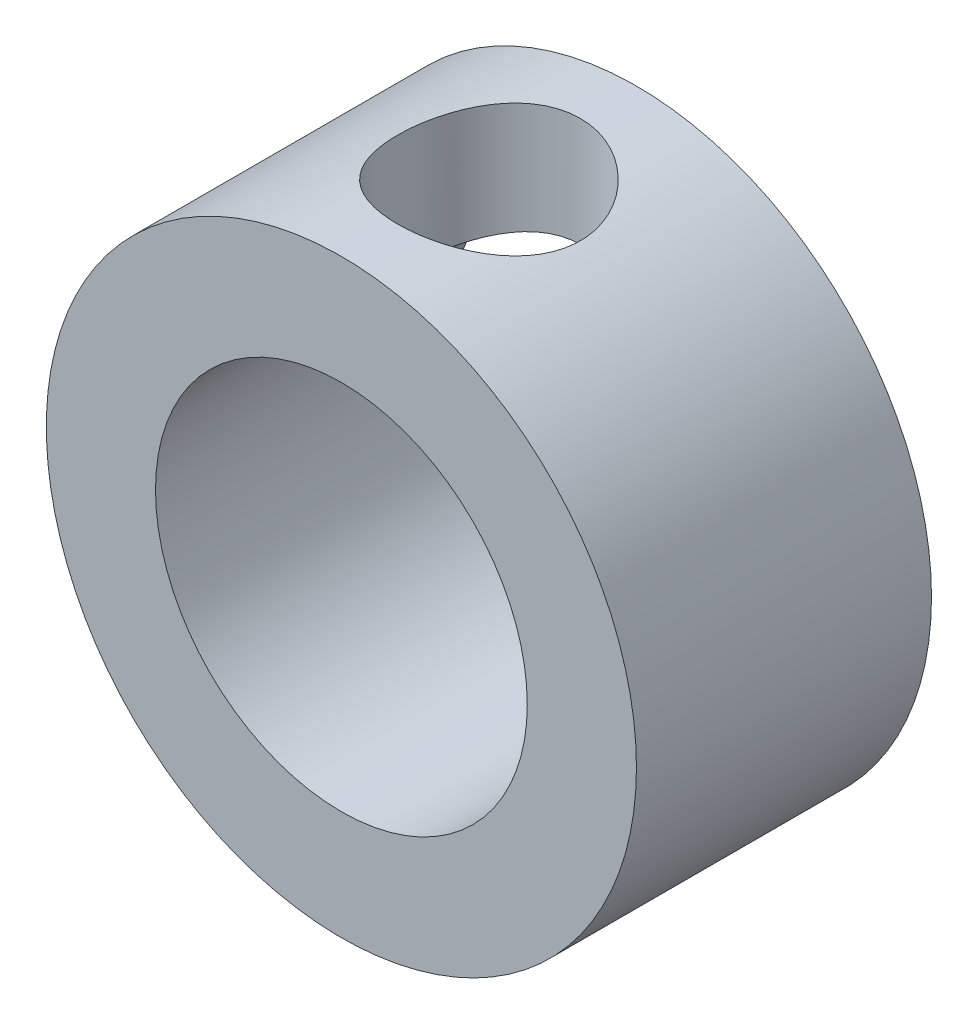
ISO-10303-21;
HEADER;
FILE_DESCRIPTION(('STEP AP214'),'2;1');
FILE_NAME('part.step','',(''),(''),'','','');
FILE_SCHEMA(('AUTOMOTIVE_DESIGN { 1 0 10303 214 1 1 1 1 }'));
ENDSEC;
DATA;
#1=APPLICATION_CONTEXT('core data for automotive mechanical design processes');
#2=APPLICATION_PROTOCOL_DEFINITION('international standard','automotive_design',2000,#1);
#3=PRODUCT_CONTEXT('',#1,'mechanical');
#4=PRODUCT('Part','Part','',(#3));
#5=PRODUCT_RELATED_PRODUCT_CATEGORY('part','',(#4));
#6=PRODUCT_DEFINITION_FORMATION('','',#4);
#7=PRODUCT_DEFINITION_CONTEXT('part definition',#1,'design');
#8=PRODUCT_DEFINITION('design','',#6,#7);
#9=PRODUCT_DEFINITION_SHAPE('','',#8);
#10=(LENGTH_UNIT() NAMED_UNIT(*) SI_UNIT(.MILLI.,.METRE.));
#11=(NAMED_UNIT(*) PLANE_ANGLE_UNIT() SI_UNIT($,.RADIAN.));
#12=(NAMED_UNIT(*) SI_UNIT($,.STERADIAN.) SOLID_ANGLE_UNIT());
#13=UNCERTAINTY_MEASURE_WITH_UNIT(LENGTH_MEASURE(1.E-05),#10,'distance_accuracy_value','');
#14=(GEOMETRIC_REPRESENTATION_CONTEXT(3) GLOBAL_UNCERTAINTY_ASSIGNED_CONTEXT((#13)) GLOBAL_UNIT_ASSIGNED_CONTEXT((#10,
#11,#12)) REPRESENTATION_CONTEXT('',''));
#15=CARTESIAN_POINT('',(0.,0.,0.));
#16=DIRECTION('',(0.,0.,1.));
#17=DIRECTION('',(1.,0.,0.));
#18=AXIS2_PLACEMENT_3D('',#15,#16,#17);
#19=CARTESIAN_POINT('',(0.,0.,12.7));
#20=DIRECTION('',(0.,0.,1.));
#21=DIRECTION('',(1.,0.,0.));
#22=AXIS2_PLACEMENT_3D('',#19,#20,#21);
#23=PLANE('',#22);
#24=CARTESIAN_POINT('',(0.,0.,12.7));
#25=DIRECTION('',(0.,0.,1.));
#26=DIRECTION('',(1.,0.,0.));
#27=AXIS2_PLACEMENT_3D('',#24,#25,#26);
#28=CIRCLE('',#27,12.7);
#29=CARTESIAN_POINT('',(12.7,0.,12.7));
#30=VERTEX_POINT('',#29);
#31=EDGE_CURVE('E10',#30,#30,#28,.T.);
#32=ORIENTED_EDGE('',*,*,#31,.T.);
#33=EDGE_LOOP('',(#32));
#34=FACE_BOUND('',#33,.T.);
#35=CARTESIAN_POINT('',(0.,0.,12.7));
#36=DIRECTION('',(0.,0.,1.));
#37=DIRECTION('',(1.,0.,0.));
#38=AXIS2_PLACEMENT_3D('',#35,#36,#37);
#39=CIRCLE('',#38,8.001);
#40=CARTESIAN_POINT('',(8.001,0.,12.7));
#41=VERTEX_POINT('',#40);
#42=EDGE_CURVE('E42',#41,#41,#39,.T.);
#43=ORIENTED_EDGE('',*,*,#42,.F.);
#44=EDGE_LOOP('',(#43));
#45=FACE_BOUND('',#44,.T.);
#46=ADVANCED_FACE('F31',(#34,#45),#23,.T.);
#47=CARTESIAN_POINT('',(0.,0.,0.));
#48=DIRECTION('',(0.,0.,1.));
#49=DIRECTION('',(1.,0.,0.));
#50=AXIS2_PLACEMENT_3D('',#47,#48,#49);
#51=PLANE('',#50);
#52=CARTESIAN_POINT('',(0.,0.,0.));
#53=DIRECTION('',(0.,0.,1.));
#54=DIRECTION('',(1.,0.,0.));
#55=AXIS2_PLACEMENT_3D('',#52,#53,#54);
#56=CIRCLE('',#55,12.7);
#57=CARTESIAN_POINT('',(12.7,0.,0.));
#58=VERTEX_POINT('',#57);
#59=EDGE_CURVE('E35',#58,#58,#56,.T.);
#60=ORIENTED_EDGE('',*,*,#59,.F.);
#61=EDGE_LOOP('',(#60));
#62=FACE_BOUND('',#61,.T.);
#63=CARTESIAN_POINT('',(0.,0.,0.));
#64=DIRECTION('',(0.,0.,1.));
#65=DIRECTION('',(1.,0.,0.));
#66=AXIS2_PLACEMENT_3D('',#63,#64,#65);
#67=CIRCLE('',#66,8.001);
#68=CARTESIAN_POINT('',(8.001,0.,0.));
#69=VERTEX_POINT('',#68);
#70=EDGE_CURVE('E44',#69,#69,#67,.T.);
#71=ORIENTED_EDGE('',*,*,#70,.T.);
#72=EDGE_LOOP('',(#71));
#73=FACE_BOUND('',#72,.T.);
#74=ADVANCED_FACE('F73',(#62,#73),#51,.F.);
#75=CARTESIAN_POINT('',(0.,0.,12.7));
#76=DIRECTION('',(0.,0.,-1.));
#77=DIRECTION('',(-1.,0.,0.));
#78=AXIS2_PLACEMENT_3D('',#75,#76,#77);
#79=CYLINDRICAL_SURFACE('',#78,12.7);
#80=CARTESIAN_POINT('',(0.,12.7,10.287));
#81=CARTESIAN_POINT('',(0.215642089486983,12.6999987563342,10.2869983381677));
#82=CARTESIAN_POINT('',(0.431301317589646,12.6944557181627,10.2692244339549));
#83=CARTESIAN_POINT('',(0.856318380775849,12.6728861910642,10.198781199652));
#84=CARTESIAN_POINT('',(1.06567468547736,12.6568571772227,10.1461034650415));
#85=CARTESIAN_POINT('',(1.47189536618363,12.6160678259516,10.0077958035015));
#86=CARTESIAN_POINT('',(1.6687783589184,12.5913208806436,9.92221640042583));
#87=CARTESIAN_POINT('',(2.04539992702669,12.535654259212,9.72074807214478));
#88=CARTESIAN_POINT('',(2.22513587873847,12.5047336406885,9.60485451870215));
#89=CARTESIAN_POINT('',(2.56783415502708,12.4389521785514,9.34233271423796));
#90=CARTESIAN_POINT('',(2.73020107321679,12.4040065133576,9.19494854382388));
#91=CARTESIAN_POINT('',(3.02835442268771,12.3346078095994,8.87523903250918));
#92=CARTESIAN_POINT('',(3.16413600443,12.3001548619741,8.70290915111373));
#93=CARTESIAN_POINT('',(3.40847342926337,12.2347349225514,8.33306923185896));
#94=CARTESIAN_POINT('',(3.51628893124856,12.2038727666813,8.13504978218122));
#95=CARTESIAN_POINT('',(3.69684203312242,12.1504028689669,7.72257871212896));
#96=CARTESIAN_POINT('',(3.76958870623598,12.1277929924098,7.50813135874186));
#97=CARTESIAN_POINT('',(3.87576689166818,12.0942741927572,7.07560404333032));
#98=CARTESIAN_POINT('',(3.91030151888804,12.0830378066601,6.85782095565567));
#99=CARTESIAN_POINT('',(3.94252125216785,12.0725655704575,6.41928435562595));
#100=CARTESIAN_POINT('',(3.94021597619219,12.0733265881334,6.19853163360437));
#101=CARTESIAN_POINT('',(3.89968486889254,12.0864738855603,5.76941548492105));
#102=CARTESIAN_POINT('',(3.86285717967211,12.0984076506619,5.56090380903797));
#103=CARTESIAN_POINT('',(3.75659192607623,12.1318213065387,5.1531779329988));
#104=CARTESIAN_POINT('',(3.68715094635025,12.1533021971016,4.95396470900402));
#105=CARTESIAN_POINT('',(3.51663434847949,12.203739449427,4.56714194130884));
#106=CARTESIAN_POINT('',(3.41511679174336,12.2327991885827,4.37974126722153));
#107=CARTESIAN_POINT('',(3.18363572068765,12.2950720045889,4.02417431880269));
#108=CARTESIAN_POINT('',(3.05366491635364,12.3282861449031,3.85601299063211));
#109=CARTESIAN_POINT('',(2.76208914863372,12.3969447621297,3.53578868453762));
#110=CARTESIAN_POINT('',(2.59932873251423,12.4324225295463,3.38478301518827));
#111=CARTESIAN_POINT('',(2.25035315821874,12.5002986527697,3.1119548140765));
#112=CARTESIAN_POINT('',(2.06413631873757,12.5326967875427,2.9901343760659));
#113=CARTESIAN_POINT('',(1.67151986106116,12.591094214646,2.77843348953781));
#114=CARTESIAN_POINT('',(1.4649782151005,12.617043244784,2.68880164279578));
#115=CARTESIAN_POINT('',(1.03875800163217,12.6592560297351,2.54586641692718));
#116=CARTESIAN_POINT('',(0.819083378279634,12.6755226764853,2.49255218975551));
#117=CARTESIAN_POINT('',(0.381810448669293,12.6960741446153,2.42555838495621));
#118=CARTESIAN_POINT('',(0.164451494201548,12.7007915511028,2.41044714389471));
#119=CARTESIAN_POINT('',(-0.269717798170264,12.6989903182584,2.4162565318587));
#120=CARTESIAN_POINT('',(-0.486528210331215,12.6924732913479,2.43717199015388));
#121=CARTESIAN_POINT('',(-0.907947885226378,12.6692194956137,2.513290005732));
#122=CARTESIAN_POINT('',(-1.11272576272166,12.6527358837941,2.56764378928676));
#123=CARTESIAN_POINT('',(-1.51020076987316,12.6114731166706,2.70806281613964));
#124=CARTESIAN_POINT('',(-1.70289641145608,12.5866929419182,2.79413195662494));
#125=CARTESIAN_POINT('',(-2.07590862109453,12.5306447805498,2.9978629413193));
#126=CARTESIAN_POINT('',(-2.25581416564056,12.4992346426345,3.11623715258801));
#127=CARTESIAN_POINT('',(-2.59368931433654,12.4335212424987,3.38036119909146));
#128=CARTESIAN_POINT('',(-2.75165303985925,12.3992172088904,3.52611834621928));
#129=CARTESIAN_POINT('',(-3.04754548779429,12.3299019174205,3.84760329987095));
#130=CARTESIAN_POINT('',(-3.18445414061207,12.294915159498,4.02427736904234));
#131=CARTESIAN_POINT('',(-3.42676814889427,12.2295978804089,4.39885276631564));
#132=CARTESIAN_POINT('',(-3.53217407716747,12.1992672745851,4.59675370836395));
#133=CARTESIAN_POINT('',(-3.70782043558742,12.1470359182359,5.00770814027043));
#134=CARTESIAN_POINT('',(-3.77820318738893,12.1251011354377,5.22069621954313));
#135=CARTESIAN_POINT('',(-3.88186191379076,12.0923182688246,5.65631758311547));
#136=CARTESIAN_POINT('',(-3.91515171874048,12.0814660529278,5.87894724030239));
#137=CARTESIAN_POINT('',(-3.94269697541239,12.0725028904522,6.31688210039164));
#138=CARTESIAN_POINT('',(-3.93862366220354,12.0738464055454,6.53207233464024));
#139=CARTESIAN_POINT('',(-3.89558356334961,12.0878008302732,6.95854334156855));
#140=CARTESIAN_POINT('',(-3.85661835720876,12.1004112298726,7.16982429077391));
#141=CARTESIAN_POINT('',(-3.74601134558578,12.1351003944793,7.57954296032231));
#142=CARTESIAN_POINT('',(-3.67484051149708,12.1570424257581,7.77812027073965));
#143=CARTESIAN_POINT('',(-3.50221244498937,12.2078895642286,8.16067377466573));
#144=CARTESIAN_POINT('',(-3.40074912314418,12.2367960712003,8.3446470230296));
#145=CARTESIAN_POINT('',(-3.16583681693642,12.299706675948,8.70045253083303));
#146=CARTESIAN_POINT('',(-3.031304814092,12.3338644175725,8.87154252800162));
#147=CARTESIAN_POINT('',(-2.73598855917659,12.4027143096462,9.18925994506663));
#148=CARTESIAN_POINT('',(-2.57519732918472,12.4374065999169,9.33588084174014));
#149=CARTESIAN_POINT('',(-2.2257449055815,12.5047461104516,9.60518291683529));
#150=CARTESIAN_POINT('',(-2.03635744604298,12.5372925872449,9.7269496322864));
#151=CARTESIAN_POINT('',(-1.63879142431975,12.5954207736272,9.93675317700581));
#152=CARTESIAN_POINT('',(-1.43062058099889,12.6210053269557,10.0248037843074));
#153=CARTESIAN_POINT('',(-1.02056324107983,12.6604515654367,10.1579747881106));
#154=CARTESIAN_POINT('',(-0.81976978605113,12.6751547281573,10.2062215570526));
#155=CARTESIAN_POINT('',(-0.412655394574239,12.6949286021706,10.2707318426619));
#156=CARTESIAN_POINT('',(-0.206335542898133,12.7000011899925,10.287001590112));
#157=CARTESIAN_POINT('',(0.,12.7,10.287));
#158=B_SPLINE_CURVE_WITH_KNOTS('',3,(#80,#81,#82,#83,#84,#85,#86,#87,#88,#89,#90,#91,#92,#93,
#94,#95,#96,#97,#98,#99,#100,#101,#102,#103,#104,#105,#106,#107,#108,#109,#110,#111,#112,#113,
#114,#115,#116,#117,#118,#119,#120,#121,#122,#123,#124,#125,#126,#127,#128,#129,#130,#131,#132,
#133,#134,#135,#136,#137,#138,#139,#140,#141,#142,#143,#144,#145,#146,#147,#148,#149,#150,#151,
#152,#153,#154,#155,#156,#157),.UNSPECIFIED.,.T.,.F.,(4,2,2,2,2,2,2,2,2,2,2,2,2,2,2,2,2,2,2,2,2,
2,2,2,2,2,2,2,2,2,2,2,2,2,2,2,2,2,4),(0.,0.646167948690249,1.29249154523124,1.93782658508891,
2.58326020955959,3.24639981304979,3.9096602700524,4.58901006762707,5.26818400514975,
5.92719377915793,6.58603150523925,7.21928891462372,7.8526126552007,8.49507333584608,
9.13769881456589,9.80908495704148,10.4805192504219,11.1570330250362,11.8333446367931,
12.4839082677489,13.1343785343706,13.7689825533425,14.403664578557,15.0536649384308,
15.7038391111452,16.3793387552344,17.0548261160791,17.7275456528965,18.4000142777847,
19.0425556535301,19.6850679438511,20.3184735488257,20.952006567458,21.6099821106715,
22.2681327844909,22.9473097519694,23.6262088779247,24.2446104225972,24.8628914586119),.UNSPECIFIED.);
#159=CARTESIAN_POINT('',(0.,12.7,10.287));
#160=VERTEX_POINT('',#159);
#161=EDGE_CURVE('E56',#160,#160,#158,.T.);
#162=ORIENTED_EDGE('',*,*,#161,.F.);
#163=EDGE_LOOP('',(#162));
#164=FACE_BOUND('',#163,.T.);
#165=ORIENTED_EDGE('',*,*,#31,.F.);
#166=EDGE_LOOP('',(#165));
#167=FACE_BOUND('',#166,.T.);
#168=ORIENTED_EDGE('',*,*,#59,.T.);
#169=EDGE_LOOP('',(#168));
#170=FACE_BOUND('',#169,.T.);
#171=ADVANCED_FACE('F33',(#164,#167,#170),#79,.T.);
#172=CARTESIAN_POINT('',(0.,0.,12.7));
#173=DIRECTION('',(0.,0.,-1.));
#174=DIRECTION('',(-1.,0.,0.));
#175=AXIS2_PLACEMENT_3D('',#172,#173,#174);
#176=CYLINDRICAL_SURFACE('',#175,8.001);
#177=CARTESIAN_POINT('',(0.,8.001,10.287));
#178=CARTESIAN_POINT('',(0.103731120040512,8.00099954830052,10.2869994807094));
#179=CARTESIAN_POINT('',(0.207472620866932,7.99897775985116,10.2828953118971));
#180=CARTESIAN_POINT('',(0.414192612313325,7.99094207562877,10.2665255803535));
#181=CARTESIAN_POINT('',(0.517170733633973,7.98492636082867,10.2542562988292));
#182=CARTESIAN_POINT('',(0.721708476706744,7.96904437787293,10.2216715759826));
#183=CARTESIAN_POINT('',(0.82326574050843,7.95917235075002,10.2013440999802));
#184=CARTESIAN_POINT('',(1.02409143363157,7.93583552887101,10.1528800597004));
#185=CARTESIAN_POINT('',(1.12335890919748,7.92236926536674,10.1247403028246));
#186=CARTESIAN_POINT('',(1.41586848701982,7.87718115569392,10.0292853471816));
#187=CARTESIAN_POINT('',(1.60484022218182,7.84058564914923,9.95076836464114));
#188=CARTESIAN_POINT('',(1.96655821159815,7.75778340676551,9.76670904580813));
#189=CARTESIAN_POINT('',(2.13930608053195,7.71157762886277,9.66116940284858));
#190=CARTESIAN_POINT('',(2.47530469331689,7.61061116771707,9.41890744840402));
#191=CARTESIAN_POINT('',(2.6373897616399,7.55550617218046,9.28071023355222));
#192=CARTESIAN_POINT('',(2.93713118735264,7.44411783251729,8.98027819701658));
#193=CARTESIAN_POINT('',(3.07476955751481,7.38783365454013,8.81802583591714));
#194=CARTESIAN_POINT('',(3.33205601945553,7.27561388999582,8.45938557910019));
#195=CARTESIAN_POINT('',(3.44960017708995,7.22001660372431,8.26135519681307));
#196=CARTESIAN_POINT('',(3.5992535240305,7.14594146537472,7.94958822473537));
#197=CARTESIAN_POINT('',(3.64470512444351,7.12279690556088,7.84317346392566));
#198=CARTESIAN_POINT('',(3.72625869504943,7.0804737169204,7.6260806595587));
#199=CARTESIAN_POINT('',(3.76236612370792,7.06129277404383,7.51540514855728));
#200=CARTESIAN_POINT('',(3.82293824347086,7.02867407138054,7.2971950186589));
#201=CARTESIAN_POINT('',(3.84796029647058,7.01496605736498,7.1898551926775));
#202=CARTESIAN_POINT('',(3.88895725579223,6.99232171706232,6.97301281147338));
#203=CARTESIAN_POINT('',(3.90493689049011,6.98338289705336,6.86351141761706));
#204=CARTESIAN_POINT('',(3.92761752942318,6.97065219167898,6.64331400515601));
#205=CARTESIAN_POINT('',(3.93432371759878,6.96685743076145,6.53261868887356));
#206=CARTESIAN_POINT('',(3.93836624505567,6.96457310453725,6.31100844001372));
#207=CARTESIAN_POINT('',(3.93570342915494,6.96608306089578,6.20009352813898));
#208=CARTESIAN_POINT('',(3.92189766636588,6.97386351911471,5.991827720554));
#209=CARTESIAN_POINT('',(3.91176752044538,6.97956525760828,5.89438693406567));
#210=CARTESIAN_POINT('',(3.88434096537129,6.99486483722935,5.70081965249849));
#211=CARTESIAN_POINT('',(3.86704229495444,7.00446390772487,5.60469358203063));
#212=CARTESIAN_POINT('',(3.80466105766818,7.03866961831927,5.3192897579736));
#213=CARTESIAN_POINT('',(3.74908319312322,7.06869095432302,5.13283955903089));
#214=CARTESIAN_POINT('',(3.61053079089778,7.14046405452993,4.76787795323816));
#215=CARTESIAN_POINT('',(3.52694750873285,7.18247307875893,4.58965312749827));
#216=CARTESIAN_POINT('',(3.33519423347212,7.27349505544527,4.24888513978849));
#217=CARTESIAN_POINT('',(3.22701323177547,7.32251114022366,4.08634904577961));
#218=CARTESIAN_POINT('',(2.97373747978153,7.42926647900956,3.76069947925983));
#219=CARTESIAN_POINT('',(2.82574636841471,7.48733945873738,3.59994613393415));
#220=CARTESIAN_POINT('',(2.50450728178395,7.60081483449948,3.3045148946384));
#221=CARTESIAN_POINT('',(2.33124801598367,7.6562160218972,3.16984872012321));
#222=CARTESIAN_POINT('',(2.05120845071607,7.7342452509396,2.98760704150859));
#223=CARTESIAN_POINT('',(1.95219123037147,7.7598901258175,2.92915155810497));
#224=CARTESIAN_POINT('',(1.74887037728496,7.80822302245697,2.82088304687542));
#225=CARTESIAN_POINT('',(1.64456914199426,7.83091236879871,2.77106614415527));
#226=CARTESIAN_POINT('',(1.43138523642182,7.87267030148338,2.68059744899432));
#227=CARTESIAN_POINT('',(1.32250323990816,7.89173941805442,2.63994431424103));
#228=CARTESIAN_POINT('',(1.10102397779922,7.92567250162842,2.56830076218248));
#229=CARTESIAN_POINT('',(0.98842883924895,7.94053883099793,2.53730491555749));
#230=CARTESIAN_POINT('',(0.769636135527749,7.9645954481398,2.48746400849326));
#231=CARTESIAN_POINT('',(0.663655121763004,7.97414685338846,2.46784050646097));
#232=CARTESIAN_POINT('',(0.450195224829172,7.98904021595624,2.43733984135855));
#233=CARTESIAN_POINT('',(0.342717083376015,7.99438418719959,2.42645849373052));
#234=CARTESIAN_POINT('',(0.127119907388824,8.00071685044189,2.41357145525717));
#235=CARTESIAN_POINT('',(0.0190009844766266,8.00170627988102,2.41156426157666));
#236=CARTESIAN_POINT('',(-0.196982807742857,7.99930389043465,2.41644752256848));
#237=CARTESIAN_POINT('',(-0.304847687427723,7.99591225373684,2.42333760724536));
#238=CARTESIAN_POINT('',(-0.511393766998843,7.98525850812486,2.44507944667013));
#239=CARTESIAN_POINT('',(-0.610158107227134,7.97830506973166,2.45929674259829));
#240=CARTESIAN_POINT('',(-0.806038738236805,7.96090414874475,2.49510692752352));
#241=CARTESIAN_POINT('',(-0.903154457145227,7.95045547873775,2.51670232308969));
#242=CARTESIAN_POINT('',(-1.19099601633747,7.91421391219015,2.59224047488186));
#243=CARTESIAN_POINT('',(-1.37840209860448,7.88351522038828,2.65695518504874));
#244=CARTESIAN_POINT('',(-1.74490332652942,7.81071946149337,2.81498303857136));
#245=CARTESIAN_POINT('',(-1.9235955918385,7.768315531765,2.90907660754034));
#246=CARTESIAN_POINT('',(-2.26328907334069,7.67623045755211,3.12234987139052));
#247=CARTESIAN_POINT('',(-2.42428261342642,7.62654617713276,3.24154038623453));
#248=CARTESIAN_POINT('',(-2.74029599593917,7.51912537288185,3.51477598567983));
#249=CARTESIAN_POINT('',(-2.89326622126244,7.46107342044733,3.67106618387604));
#250=CARTESIAN_POINT('',(-3.17175624721418,7.34701580450231,4.00744216534014));
#251=CARTESIAN_POINT('',(-3.29725853250518,7.29101146552924,4.18754301510629));
#252=CARTESIAN_POINT('',(-3.46477818023188,7.21216781878012,4.47690604611348));
#253=CARTESIAN_POINT('',(-3.51805602770533,7.186254987632,4.57896224256098));
#254=CARTESIAN_POINT('',(-3.61570186733317,7.13762375728275,4.78796495442613));
#255=CARTESIAN_POINT('',(-3.66007388934301,7.11490391466687,4.89490923098632));
#256=CARTESIAN_POINT('',(-3.73938716641769,7.0735413870091,5.11290725226169));
#257=CARTESIAN_POINT('',(-3.77433584325825,7.0548954955538,5.22395768413595));
#258=CARTESIAN_POINT('',(-3.83437794111843,7.0224436901725,5.44938236669095));
#259=CARTESIAN_POINT('',(-3.85947282869262,7.00863705604527,5.56375612003326));
#260=CARTESIAN_POINT('',(-3.89752260548261,6.98754209377657,5.7838308034243));
#261=CARTESIAN_POINT('',(-3.91140351072069,6.97975955543354,5.88932484810532));
#262=CARTESIAN_POINT('',(-3.9305798562532,6.96897877049317,6.10132835916594));
#263=CARTESIAN_POINT('',(-3.93587613647906,6.96598005584045,6.20783772517928));
#264=CARTESIAN_POINT('',(-3.93780167086967,6.9648921991218,6.42093172963581));
#265=CARTESIAN_POINT('',(-3.93443368192778,6.96680149537033,6.52751633335));
#266=CARTESIAN_POINT('',(-3.91909966809387,6.97543713140602,6.73983710043691));
#267=CARTESIAN_POINT('',(-3.9071339550188,6.98216329649793,6.84557329443859));
#268=CARTESIAN_POINT('',(-3.86146686788853,7.00758827797992,7.14136106995922));
#269=CARTESIAN_POINT('',(-3.81799029950165,7.03158096679097,7.32955065602505));
#270=CARTESIAN_POINT('',(-3.70485711948816,7.09183118000956,7.69566821029288));
#271=CARTESIAN_POINT('',(-3.63519227921642,7.12809255901711,7.87359293287135));
#272=CARTESIAN_POINT('',(-3.46639794215562,7.21176292003003,8.22750295296033));
#273=CARTESIAN_POINT('',(-3.36560195161541,7.25975760245529,8.40255307224648));
#274=CARTESIAN_POINT('',(-3.13928163129485,7.3604507938914,8.73437893246699));
#275=CARTESIAN_POINT('',(-3.01374468286014,7.41315169568728,8.89114528289561));
#276=CARTESIAN_POINT('',(-2.72440648969739,7.52464981691223,9.20088969068816));
#277=CARTESIAN_POINT('',(-2.5578532711721,7.58344335113081,9.35130763998703));
#278=CARTESIAN_POINT('',(-2.20003044185231,7.69485977608197,9.62263995938066));
#279=CARTESIAN_POINT('',(-2.00874805925143,7.74747945124191,9.74353899006109));
#280=CARTESIAN_POINT('',(-1.70648495939494,7.81759238811919,9.89976978316853));
#281=CARTESIAN_POINT('',(-1.60289749434388,7.83953738190377,9.94774807616582));
#282=CARTESIAN_POINT('',(-1.39136085574212,7.87982713969793,10.0347166820191));
#283=CARTESIAN_POINT('',(-1.28341385173508,7.89817366851251,10.0737114023594));
#284=CARTESIAN_POINT('',(-1.06420181661483,7.93068304005759,10.1421768826139));
#285=CARTESIAN_POINT('',(-0.952944745024576,7.94485514655163,10.1716687448936));
#286=CARTESIAN_POINT('',(-0.727858297931881,7.96862672101699,10.2208456129598));
#287=CARTESIAN_POINT('',(-0.614030572571798,7.97822903965906,10.2405367328814));
#288=CARTESIAN_POINT('',(-0.416738459367041,7.99056972045674,10.2657698113763));
#289=CARTESIAN_POINT('',(-0.333646236813122,7.99447489963606,10.2737249872543));
#290=CARTESIAN_POINT('',(-0.167038260438168,7.99969025626908,10.2843403620665));
#291=CARTESIAN_POINT('',(-0.0835224952497408,8.00100036370057,10.2870004181238));
#292=CARTESIAN_POINT('',(0.,8.001,10.287));
#293=B_SPLINE_CURVE_WITH_KNOTS('',3,(#177,#178,#179,#180,#181,#182,#183,#184,#185,#186,#187,
#188,#189,#190,#191,#192,#193,#194,#195,#196,#197,#198,#199,#200,#201,#202,#203,#204,#205,#206,
#207,#208,#209,#210,#211,#212,#213,#214,#215,#216,#217,#218,#219,#220,#221,#222,#223,#224,#225,
#226,#227,#228,#229,#230,#231,#232,#233,#234,#235,#236,#237,#238,#239,#240,#241,#242,#243,#244,
#245,#246,#247,#248,#249,#250,#251,#252,#253,#254,#255,#256,#257,#258,#259,#260,#261,#262,#263,
#264,#265,#266,#267,#268,#269,#270,#271,#272,#273,#274,#275,#276,#277,#278,#279,#280,#281,#282,
#283,#284,#285,#286,#287,#288,#289,#290,#291,#292),.UNSPECIFIED.,.T.,.F.,(4,2,2,2,2,2,2,2,2,2,2,
2,2,2,2,2,2,2,2,2,2,2,2,2,2,2,2,2,2,2,2,2,2,2,2,2,2,2,2,2,2,2,2,2,2,2,2,2,2,2,2,2,2,2,2,2,2,4),
(0.,0.311110487981909,0.622362768006994,0.934081656221672,1.24592812073452,1.86654269444404,
2.48709543591862,3.14434399733787,3.80207415930575,4.50880062315789,4.86240552810791,
5.21580340353415,5.5485355821954,5.88109361052718,6.21346566066154,6.5458077410486,
6.83984385713875,7.13397279565032,7.72179424689913,8.32332555600379,8.92512660954245,
9.6005224186326,10.2762209438576,10.6292557433048,10.9821317746427,11.3349560829161,
11.6875816742214,12.0117635354783,12.3357901298194,12.6597618482551,12.9837200946832,
13.2834327335021,13.5832472954097,14.1823216951248,14.7989018540844,15.4157483834778,
16.0916853946153,16.7680521792314,17.1216723926391,17.4751322315659,17.8283128688478,
18.1814409217724,18.5010602345029,18.820648273355,19.1401346347145,19.4596094097244,
20.0407073615089,20.6219880535302,21.2423615844289,21.8630523477192,22.5559164392521,
23.2491398128161,23.5974861615181,23.9456612402326,24.2930577342345,24.6402372345004,
24.8907312341151,25.1412319926576),.UNSPECIFIED.);
#294=CARTESIAN_POINT('',(0.,8.001,10.287));
#295=VERTEX_POINT('',#294);
#296=EDGE_CURVE('E47',#295,#295,#293,.T.);
#297=ORIENTED_EDGE('',*,*,#296,.T.);
#298=EDGE_LOOP('',(#297));
#299=FACE_BOUND('',#298,.T.);
#300=ORIENTED_EDGE('',*,*,#42,.T.);
#301=EDGE_LOOP('',(#300));
#302=FACE_BOUND('',#301,.T.);
#303=ORIENTED_EDGE('',*,*,#70,.F.);
#304=EDGE_LOOP('',(#303));
#305=FACE_BOUND('',#304,.T.);
#306=ADVANCED_FACE('F66',(#299,#302,#305),#176,.F.);
#307=CARTESIAN_POINT('',(0.,-12.701,6.35));
#308=DIRECTION('',(0.,1.,0.));
#309=DIRECTION('',(0.,0.,1.));
#310=AXIS2_PLACEMENT_3D('',#307,#308,#309);
#311=CYLINDRICAL_SURFACE('',#310,3.937);
#312=ORIENTED_EDGE('',*,*,#296,.F.);
#313=EDGE_LOOP('',(#312));
#314=FACE_BOUND('',#313,.T.);
#315=ORIENTED_EDGE('',*,*,#161,.T.);
#316=EDGE_LOOP('',(#315));
#317=FACE_BOUND('',#316,.T.);
#318=ADVANCED_FACE('F60',(#314,#317),#311,.F.);
#319=CLOSED_SHELL('',(#46,#74,#171,#306,#318));
#320=MANIFOLD_SOLID_BREP('B2',#319);
#321=ADVANCED_BREP_SHAPE_REPRESENTATION('',(#18,#320),#14);
#322=SHAPE_DEFINITION_REPRESENTATION(#9,#321);
ENDSEC;
END-ISO-10303-21;
